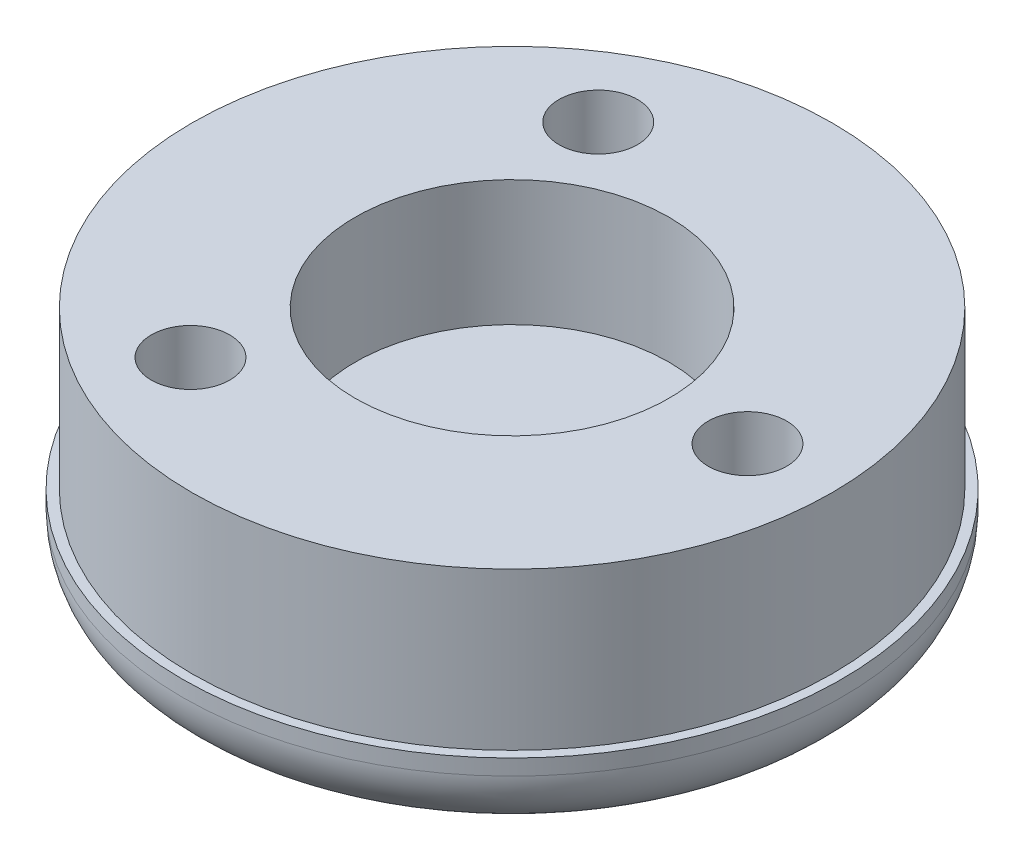
ISO-10303-21;
HEADER;
FILE_DESCRIPTION(('STEP AP214'),'2;1');
FILE_NAME('part.step','',(''),(''),'','','');
FILE_SCHEMA(('AUTOMOTIVE_DESIGN { 1 0 10303 214 1 1 1 1 }'));
ENDSEC;
DATA;
#1=APPLICATION_CONTEXT('core data for automotive mechanical design processes');
#2=APPLICATION_PROTOCOL_DEFINITION('international standard','automotive_design',2000,#1);
#3=PRODUCT_CONTEXT('',#1,'mechanical');
#4=PRODUCT('Part','Part','',(#3));
#5=PRODUCT_RELATED_PRODUCT_CATEGORY('part','',(#4));
#6=PRODUCT_DEFINITION_FORMATION('','',#4);
#7=PRODUCT_DEFINITION_CONTEXT('part definition',#1,'design');
#8=PRODUCT_DEFINITION('design','',#6,#7);
#9=PRODUCT_DEFINITION_SHAPE('','',#8);
#10=(LENGTH_UNIT() NAMED_UNIT(*) SI_UNIT(.MILLI.,.METRE.));
#11=(NAMED_UNIT(*) PLANE_ANGLE_UNIT() SI_UNIT($,.RADIAN.));
#12=(NAMED_UNIT(*) SI_UNIT($,.STERADIAN.) SOLID_ANGLE_UNIT());
#13=UNCERTAINTY_MEASURE_WITH_UNIT(LENGTH_MEASURE(1.E-05),#10,'distance_accuracy_value','');
#14=(GEOMETRIC_REPRESENTATION_CONTEXT(3) GLOBAL_UNCERTAINTY_ASSIGNED_CONTEXT((#13)) GLOBAL_UNIT_ASSIGNED_CONTEXT((#10,
#11,#12)) REPRESENTATION_CONTEXT('',''));
#15=CARTESIAN_POINT('',(0.,0.,0.));
#16=DIRECTION('',(0.,0.,1.));
#17=DIRECTION('',(1.,0.,0.));
#18=AXIS2_PLACEMENT_3D('',#15,#16,#17);
#19=CARTESIAN_POINT('',(0.,3.175,0.));
#20=DIRECTION('',(0.,-1.,0.));
#21=DIRECTION('',(0.,0.,-1.));
#22=AXIS2_PLACEMENT_3D('',#19,#20,#21);
#23=CYLINDRICAL_SURFACE('',#22,13.335);
#24=CARTESIAN_POINT('',(0.,2.54,0.));
#25=DIRECTION('',(0.,1.,0.));
#26=DIRECTION('',(0.,0.,1.));
#27=AXIS2_PLACEMENT_3D('',#24,#25,#26);
#28=CIRCLE('',#27,13.335);
#29=CARTESIAN_POINT('',(0.,2.54,13.335));
#30=VERTEX_POINT('',#29);
#31=EDGE_CURVE('E42',#30,#30,#28,.T.);
#32=ORIENTED_EDGE('',*,*,#31,.T.);
#33=EDGE_LOOP('',(#32));
#34=FACE_BOUND('',#33,.T.);
#35=CARTESIAN_POINT('',(0.,3.175,0.));
#36=DIRECTION('',(0.,1.,0.));
#37=DIRECTION('',(0.,0.,1.));
#38=AXIS2_PLACEMENT_3D('',#35,#36,#37);
#39=CIRCLE('',#38,13.335);
#40=CARTESIAN_POINT('',(0.,3.175,13.335));
#41=VERTEX_POINT('',#40);
#42=EDGE_CURVE('E50',#41,#41,#39,.T.);
#43=ORIENTED_EDGE('',*,*,#42,.F.);
#44=EDGE_LOOP('',(#43));
#45=FACE_BOUND('',#44,.T.);
#46=ADVANCED_FACE('F35',(#34,#45),#23,.T.);
#47=CARTESIAN_POINT('',(0.,3.175,0.));
#48=DIRECTION('',(0.,1.,0.));
#49=DIRECTION('',(0.,0.,1.));
#50=AXIS2_PLACEMENT_3D('',#47,#48,#49);
#51=PLANE('',#50);
#52=CARTESIAN_POINT('',(0.,3.175,0.));
#53=DIRECTION('',(0.,1.,0.));
#54=DIRECTION('',(0.,0.,1.));
#55=AXIS2_PLACEMENT_3D('',#52,#53,#54);
#56=CIRCLE('',#55,12.954);
#57=CARTESIAN_POINT('',(0.,3.175,12.954));
#58=VERTEX_POINT('',#57);
#59=EDGE_CURVE('E46',#58,#58,#56,.T.);
#60=ORIENTED_EDGE('',*,*,#59,.F.);
#61=EDGE_LOOP('',(#60));
#62=FACE_BOUND('',#61,.T.);
#63=ORIENTED_EDGE('',*,*,#42,.T.);
#64=EDGE_LOOP('',(#63));
#65=FACE_BOUND('',#64,.T.);
#66=ADVANCED_FACE('F112',(#62,#65),#51,.T.);
#67=CARTESIAN_POINT('',(0.,0.,0.));
#68=DIRECTION('',(0.,1.,0.));
#69=DIRECTION('',(0.,0.,1.));
#70=AXIS2_PLACEMENT_3D('',#67,#68,#69);
#71=PLANE('',#70);
#72=CARTESIAN_POINT('',(0.,0.,0.));
#73=DIRECTION('',(0.,1.,0.));
#74=DIRECTION('',(0.,0.,1.));
#75=AXIS2_PLACEMENT_3D('',#72,#73,#74);
#76=CIRCLE('',#75,10.795);
#77=CARTESIAN_POINT('',(0.,0.,10.795));
#78=VERTEX_POINT('',#77);
#79=EDGE_CURVE('E10',#78,#78,#76,.F.);
#80=ORIENTED_EDGE('',*,*,#79,.T.);
#81=EDGE_LOOP('',(#80));
#82=FACE_BOUND('',#81,.T.);
#83=ADVANCED_FACE('F108',(#82),#71,.F.);
#84=CARTESIAN_POINT('',(0.,9.525,0.));
#85=DIRECTION('',(0.,-1.,0.));
#86=DIRECTION('',(0.,0.,-1.));
#87=AXIS2_PLACEMENT_3D('',#84,#85,#86);
#88=CYLINDRICAL_SURFACE('',#87,12.954);
#89=CARTESIAN_POINT('',(0.,9.525,0.));
#90=DIRECTION('',(0.,1.,0.));
#91=DIRECTION('',(0.,0.,1.));
#92=AXIS2_PLACEMENT_3D('',#89,#90,#91);
#93=CIRCLE('',#92,12.954);
#94=CARTESIAN_POINT('',(0.,9.525,12.954));
#95=VERTEX_POINT('',#94);
#96=EDGE_CURVE('E54',#95,#95,#93,.T.);
#97=ORIENTED_EDGE('',*,*,#96,.F.);
#98=EDGE_LOOP('',(#97));
#99=FACE_BOUND('',#98,.T.);
#100=ORIENTED_EDGE('',*,*,#59,.T.);
#101=EDGE_LOOP('',(#100));
#102=FACE_BOUND('',#101,.T.);
#103=ADVANCED_FACE('F96',(#99,#102),#88,.T.);
#104=CARTESIAN_POINT('',(0.,9.525,0.));
#105=DIRECTION('',(0.,1.,0.));
#106=DIRECTION('',(0.,0.,1.));
#107=AXIS2_PLACEMENT_3D('',#104,#105,#106);
#108=PLANE('',#107);
#109=CARTESIAN_POINT('',(-4.76250000000002,9.525,-8.24889197104677));
#110=DIRECTION('',(0.,1.,0.));
#111=DIRECTION('',(0.866025403784438,0.,-0.500000000000002));
#112=AXIS2_PLACEMENT_3D('',#109,#110,#111);
#113=CIRCLE('',#112,1.5875);
#114=CARTESIAN_POINT('',(-3.38768467149222,9.525,-9.04264197104677));
#115=VERTEX_POINT('',#114);
#116=EDGE_CURVE('E77',#115,#115,#113,.T.);
#117=ORIENTED_EDGE('',*,*,#116,.F.);
#118=EDGE_LOOP('',(#117));
#119=FACE_BOUND('',#118,.T.);
#120=CARTESIAN_POINT('',(-4.76249999999997,9.525,8.2488919710468));
#121=DIRECTION('',(0.,1.,0.));
#122=DIRECTION('',(-0.866025403784441,0.,-0.499999999999997));
#123=AXIS2_PLACEMENT_3D('',#120,#121,#122);
#124=CIRCLE('',#123,1.5875);
#125=CARTESIAN_POINT('',(-6.13731532850777,9.525,7.4551419710468));
#126=VERTEX_POINT('',#125);
#127=EDGE_CURVE('E71',#126,#126,#124,.T.);
#128=ORIENTED_EDGE('',*,*,#127,.F.);
#129=EDGE_LOOP('',(#128));
#130=FACE_BOUND('',#129,.T.);
#131=CARTESIAN_POINT('',(9.525,9.525,0.));
#132=DIRECTION('',(0.,1.,0.));
#133=DIRECTION('',(0.,0.,1.));
#134=AXIS2_PLACEMENT_3D('',#131,#132,#133);
#135=CIRCLE('',#134,1.5875);
#136=CARTESIAN_POINT('',(9.525,9.525,1.5875));
#137=VERTEX_POINT('',#136);
#138=EDGE_CURVE('E65',#137,#137,#135,.T.);
#139=ORIENTED_EDGE('',*,*,#138,.F.);
#140=EDGE_LOOP('',(#139));
#141=FACE_BOUND('',#140,.T.);
#142=CARTESIAN_POINT('',(0.,9.525,0.));
#143=DIRECTION('',(0.,1.,0.));
#144=DIRECTION('',(0.,0.,1.));
#145=AXIS2_PLACEMENT_3D('',#142,#143,#144);
#146=CIRCLE('',#145,6.35);
#147=CARTESIAN_POINT('',(0.,9.525,6.35));
#148=VERTEX_POINT('',#147);
#149=EDGE_CURVE('E59',#148,#148,#146,.T.);
#150=ORIENTED_EDGE('',*,*,#149,.F.);
#151=EDGE_LOOP('',(#150));
#152=FACE_BOUND('',#151,.T.);
#153=ORIENTED_EDGE('',*,*,#96,.T.);
#154=EDGE_LOOP('',(#153));
#155=FACE_BOUND('',#154,.T.);
#156=ADVANCED_FACE('F92',(#119,#130,#141,#152,#155),#108,.T.);
#157=CARTESIAN_POINT('',(0.,4.445,0.));
#158=DIRECTION('',(0.,1.,0.));
#159=DIRECTION('',(0.,0.,1.));
#160=AXIS2_PLACEMENT_3D('',#157,#158,#159);
#161=CYLINDRICAL_SURFACE('',#160,6.35);
#162=CARTESIAN_POINT('',(0.,4.445,0.));
#163=DIRECTION('',(0.,1.,0.));
#164=DIRECTION('',(0.,0.,1.));
#165=AXIS2_PLACEMENT_3D('',#162,#163,#164);
#166=CIRCLE('',#165,6.35);
#167=CARTESIAN_POINT('',(0.,4.445,6.35));
#168=VERTEX_POINT('',#167);
#169=EDGE_CURVE('E58',#168,#168,#166,.T.);
#170=ORIENTED_EDGE('',*,*,#169,.F.);
#171=EDGE_LOOP('',(#170));
#172=FACE_BOUND('',#171,.T.);
#173=ORIENTED_EDGE('',*,*,#149,.T.);
#174=EDGE_LOOP('',(#173));
#175=FACE_BOUND('',#174,.T.);
#176=ADVANCED_FACE('F95',(#172,#175),#161,.F.);
#177=CARTESIAN_POINT('',(0.,4.445,0.));
#178=DIRECTION('',(0.,1.,0.));
#179=DIRECTION('',(0.,0.,1.));
#180=AXIS2_PLACEMENT_3D('',#177,#178,#179);
#181=PLANE('',#180);
#182=ORIENTED_EDGE('',*,*,#169,.T.);
#183=EDGE_LOOP('',(#182));
#184=FACE_BOUND('',#183,.T.);
#185=ADVANCED_FACE('F126',(#184),#181,.T.);
#186=CARTESIAN_POINT('',(9.525,6.985,0.));
#187=DIRECTION('',(0.,1.,0.));
#188=DIRECTION('',(0.,0.,1.));
#189=AXIS2_PLACEMENT_3D('',#186,#187,#188);
#190=CYLINDRICAL_SURFACE('',#189,1.5875);
#191=CARTESIAN_POINT('',(9.525,6.985,0.));
#192=DIRECTION('',(0.,1.,0.));
#193=DIRECTION('',(0.,0.,1.));
#194=AXIS2_PLACEMENT_3D('',#191,#192,#193);
#195=CIRCLE('',#194,1.5875);
#196=CARTESIAN_POINT('',(9.525,6.985,1.5875));
#197=VERTEX_POINT('',#196);
#198=EDGE_CURVE('E62',#197,#197,#195,.T.);
#199=ORIENTED_EDGE('',*,*,#198,.F.);
#200=EDGE_LOOP('',(#199));
#201=FACE_BOUND('',#200,.T.);
#202=ORIENTED_EDGE('',*,*,#138,.T.);
#203=EDGE_LOOP('',(#202));
#204=FACE_BOUND('',#203,.T.);
#205=ADVANCED_FACE('F130',(#201,#204),#190,.F.);
#206=CARTESIAN_POINT('',(9.525,6.985,0.));
#207=DIRECTION('',(0.,1.,0.));
#208=DIRECTION('',(0.,0.,1.));
#209=AXIS2_PLACEMENT_3D('',#206,#207,#208);
#210=PLANE('',#209);
#211=ORIENTED_EDGE('',*,*,#198,.T.);
#212=EDGE_LOOP('',(#211));
#213=FACE_BOUND('',#212,.T.);
#214=ADVANCED_FACE('F134',(#213),#210,.T.);
#215=CARTESIAN_POINT('',(-4.76249999999997,6.985,8.2488919710468));
#216=DIRECTION('',(0.,1.,0.));
#217=DIRECTION('',(0.,0.,1.));
#218=AXIS2_PLACEMENT_3D('',#215,#216,#217);
#219=CYLINDRICAL_SURFACE('',#218,1.5875);
#220=CARTESIAN_POINT('',(-4.76249999999997,6.985,8.2488919710468));
#221=DIRECTION('',(0.,1.,0.));
#222=DIRECTION('',(-0.866025403784441,0.,-0.499999999999997));
#223=AXIS2_PLACEMENT_3D('',#220,#221,#222);
#224=CIRCLE('',#223,1.5875);
#225=CARTESIAN_POINT('',(-6.13731532850777,6.985,7.4551419710468));
#226=VERTEX_POINT('',#225);
#227=EDGE_CURVE('E74',#226,#226,#224,.T.);
#228=ORIENTED_EDGE('',*,*,#227,.F.);
#229=EDGE_LOOP('',(#228));
#230=FACE_BOUND('',#229,.T.);
#231=ORIENTED_EDGE('',*,*,#127,.T.);
#232=EDGE_LOOP('',(#231));
#233=FACE_BOUND('',#232,.T.);
#234=ADVANCED_FACE('F138',(#230,#233),#219,.F.);
#235=CARTESIAN_POINT('',(-4.76249999999997,6.985,8.2488919710468));
#236=DIRECTION('',(0.,1.,0.));
#237=DIRECTION('',(-0.866025403784441,0.,-0.499999999999997));
#238=AXIS2_PLACEMENT_3D('',#235,#236,#237);
#239=PLANE('',#238);
#240=ORIENTED_EDGE('',*,*,#227,.T.);
#241=EDGE_LOOP('',(#240));
#242=FACE_BOUND('',#241,.T.);
#243=ADVANCED_FACE('F88',(#242),#239,.T.);
#244=CARTESIAN_POINT('',(-4.76250000000002,6.985,-8.24889197104677));
#245=DIRECTION('',(0.,1.,0.));
#246=DIRECTION('',(0.,0.,1.));
#247=AXIS2_PLACEMENT_3D('',#244,#245,#246);
#248=CYLINDRICAL_SURFACE('',#247,1.5875);
#249=CARTESIAN_POINT('',(-4.76250000000002,6.985,-8.24889197104677));
#250=DIRECTION('',(0.,1.,0.));
#251=DIRECTION('',(0.866025403784438,0.,-0.500000000000002));
#252=AXIS2_PLACEMENT_3D('',#249,#250,#251);
#253=CIRCLE('',#252,1.5875);
#254=CARTESIAN_POINT('',(-3.38768467149222,6.985,-9.04264197104677));
#255=VERTEX_POINT('',#254);
#256=EDGE_CURVE('E68',#255,#255,#253,.T.);
#257=ORIENTED_EDGE('',*,*,#256,.F.);
#258=EDGE_LOOP('',(#257));
#259=FACE_BOUND('',#258,.T.);
#260=ORIENTED_EDGE('',*,*,#116,.T.);
#261=EDGE_LOOP('',(#260));
#262=FACE_BOUND('',#261,.T.);
#263=ADVANCED_FACE('F85',(#259,#262),#248,.F.);
#264=CARTESIAN_POINT('',(-4.76250000000002,6.985,-8.24889197104677));
#265=DIRECTION('',(0.,1.,0.));
#266=DIRECTION('',(0.866025403784438,0.,-0.500000000000002));
#267=AXIS2_PLACEMENT_3D('',#264,#265,#266);
#268=PLANE('',#267);
#269=ORIENTED_EDGE('',*,*,#256,.T.);
#270=EDGE_LOOP('',(#269));
#271=FACE_BOUND('',#270,.T.);
#272=ADVANCED_FACE('F83',(#271),#268,.T.);
#273=CARTESIAN_POINT('',(0.,2.54,0.));
#274=DIRECTION('',(0.,1.,0.));
#275=DIRECTION('',(0.,0.,1.));
#276=AXIS2_PLACEMENT_3D('',#273,#274,#275);
#277=TOROIDAL_SURFACE('',#276,10.795,2.54);
#278=ORIENTED_EDGE('',*,*,#79,.F.);
#279=EDGE_LOOP('',(#278));
#280=FACE_BOUND('',#279,.T.);
#281=ORIENTED_EDGE('',*,*,#31,.F.);
#282=EDGE_LOOP('',(#281));
#283=FACE_BOUND('',#282,.T.);
#284=ADVANCED_FACE('F37',(#280,#283),#277,.T.);
#285=CLOSED_SHELL('',(#46,#66,#83,#103,#156,#176,#185,#205,#214,#234,#243,#263,#272,#284));
#286=MANIFOLD_SOLID_BREP('B2',#285);
#287=ADVANCED_BREP_SHAPE_REPRESENTATION('',(#18,#286),#14);
#288=SHAPE_DEFINITION_REPRESENTATION(#9,#287);
ENDSEC;
END-ISO-10303-21;
